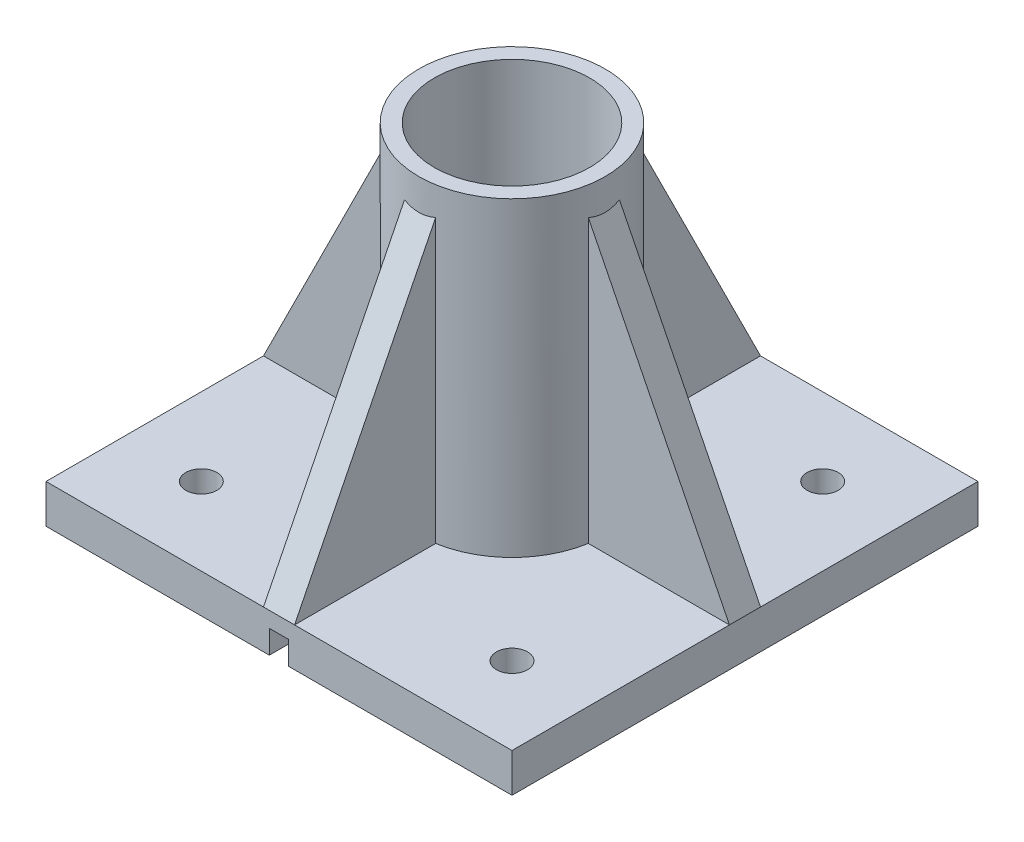
ISO-10303-21;
HEADER;
FILE_DESCRIPTION(('STEP AP214'),'2;1');
FILE_NAME('part.step','',(''),(''),'','','');
FILE_SCHEMA(('AUTOMOTIVE_DESIGN { 1 0 10303 214 1 1 1 1 }'));
ENDSEC;
DATA;
#1=APPLICATION_CONTEXT('core data for automotive mechanical design processes');
#2=APPLICATION_PROTOCOL_DEFINITION('international standard','automotive_design',2000,#1);
#3=PRODUCT_CONTEXT('',#1,'mechanical');
#4=PRODUCT('Part','Part','',(#3));
#5=PRODUCT_RELATED_PRODUCT_CATEGORY('part','',(#4));
#6=PRODUCT_DEFINITION_FORMATION('','',#4);
#7=PRODUCT_DEFINITION_CONTEXT('part definition',#1,'design');
#8=PRODUCT_DEFINITION('design','',#6,#7);
#9=PRODUCT_DEFINITION_SHAPE('','',#8);
#10=(LENGTH_UNIT() NAMED_UNIT(*) SI_UNIT(.MILLI.,.METRE.));
#11=(NAMED_UNIT(*) PLANE_ANGLE_UNIT() SI_UNIT($,.RADIAN.));
#12=(NAMED_UNIT(*) SI_UNIT($,.STERADIAN.) SOLID_ANGLE_UNIT());
#13=UNCERTAINTY_MEASURE_WITH_UNIT(LENGTH_MEASURE(1.E-05),#10,'distance_accuracy_value','');
#14=(GEOMETRIC_REPRESENTATION_CONTEXT(3) GLOBAL_UNCERTAINTY_ASSIGNED_CONTEXT((#13)) GLOBAL_UNIT_ASSIGNED_CONTEXT((#10,
#11,#12)) REPRESENTATION_CONTEXT('',''));
#15=CARTESIAN_POINT('',(0.,0.,0.));
#16=DIRECTION('',(0.,0.,1.));
#17=DIRECTION('',(1.,0.,0.));
#18=AXIS2_PLACEMENT_3D('',#15,#16,#17);
#19=CARTESIAN_POINT('',(0.,5.,0.));
#20=DIRECTION('',(0.,-1.,0.));
#21=DIRECTION('',(0.,0.,-1.));
#22=AXIS2_PLACEMENT_3D('',#19,#20,#21);
#23=PLANE('',#22);
#24=CARTESIAN_POINT('',(19.9999999999999,5.,-20.));
#25=DIRECTION('',(0.,1.,0.));
#26=DIRECTION('',(0.,0.,1.));
#27=AXIS2_PLACEMENT_3D('',#24,#25,#26);
#28=CIRCLE('',#27,2.);
#29=CARTESIAN_POINT('',(19.9999999999999,5.,-18.));
#30=VERTEX_POINT('',#29);
#31=EDGE_CURVE('E292',#30,#30,#28,.T.);
#32=ORIENTED_EDGE('',*,*,#31,.F.);
#33=EDGE_LOOP('',(#32));
#34=FACE_BOUND('',#33,.T.);
#35=DIRECTION('',(1.,0.,0.));
#36=VECTOR('',#35,1.);
#37=CARTESIAN_POINT('',(0.,5.,-2.));
#38=LINE('',#37,#36);
#39=CARTESIAN_POINT('',(30.,5.,-2.0000000000003));
#40=VERTEX_POINT('',#39);
#41=CARTESIAN_POINT('',(11.8321595661992,5.,-2.00000000000012));
#42=VERTEX_POINT('',#41);
#43=EDGE_CURVE('E58',#40,#42,#38,.F.);
#44=ORIENTED_EDGE('',*,*,#43,.F.);
#45=DIRECTION('',(0.,0.,-1.));
#46=VECTOR('',#45,1.);
#47=CARTESIAN_POINT('',(30.,5.,30.));
#48=LINE('',#47,#46);
#49=CARTESIAN_POINT('',(30.,5.,-30.));
#50=VERTEX_POINT('',#49);
#51=EDGE_CURVE('E330',#40,#50,#48,.T.);
#52=ORIENTED_EDGE('',*,*,#51,.T.);
#53=DIRECTION('',(-1.,0.,0.));
#54=VECTOR('',#53,1.);
#55=CARTESIAN_POINT('',(-30.,5.,-30.));
#56=LINE('',#55,#54);
#57=CARTESIAN_POINT('',(2.,5.,-30.));
#58=VERTEX_POINT('',#57);
#59=EDGE_CURVE('E331',#50,#58,#56,.T.);
#60=ORIENTED_EDGE('',*,*,#59,.T.);
#61=DIRECTION('',(0.,0.,-1.));
#62=VECTOR('',#61,1.);
#63=CARTESIAN_POINT('',(2.,5.,0.));
#64=LINE('',#63,#62);
#65=CARTESIAN_POINT('',(2.,5.,-11.8321595661992));
#66=VERTEX_POINT('',#65);
#67=EDGE_CURVE('E272',#58,#66,#64,.F.);
#68=ORIENTED_EDGE('',*,*,#67,.T.);
#69=CARTESIAN_POINT('',(0.,5.,0.));
#70=DIRECTION('',(0.,-1.,0.));
#71=DIRECTION('',(0.,0.,-1.));
#72=AXIS2_PLACEMENT_3D('',#69,#70,#71);
#73=CIRCLE('',#72,12.);
#74=EDGE_CURVE('E43',#42,#66,#73,.F.);
#75=ORIENTED_EDGE('',*,*,#74,.F.);
#76=EDGE_LOOP('',(#44,#52,#60,#68,#75));
#77=FACE_BOUND('',#76,.T.);
#78=ADVANCED_FACE('F34',(#34,#77),#23,.F.);
#79=CARTESIAN_POINT('',(20.,5.,20.));
#80=DIRECTION('',(0.,1.,0.));
#81=DIRECTION('',(0.,0.,1.));
#82=AXIS2_PLACEMENT_3D('',#79,#80,#81);
#83=CIRCLE('',#82,2.);
#84=CARTESIAN_POINT('',(20.,5.,22.));
#85=VERTEX_POINT('',#84);
#86=EDGE_CURVE('E303',#85,#85,#83,.T.);
#87=ORIENTED_EDGE('',*,*,#86,.F.);
#88=EDGE_LOOP('',(#87));
#89=FACE_BOUND('',#88,.T.);
#90=CARTESIAN_POINT('',(30.,5.,30.));
#91=VERTEX_POINT('',#90);
#92=CARTESIAN_POINT('',(30.,5.,2.00000000000003));
#93=VERTEX_POINT('',#92);
#94=EDGE_CURVE('E326',#91,#93,#48,.T.);
#95=ORIENTED_EDGE('',*,*,#94,.T.);
#96=DIRECTION('',(1.,0.,0.));
#97=VECTOR('',#96,1.);
#98=CARTESIAN_POINT('',(0.,5.,2.));
#99=LINE('',#98,#97);
#100=CARTESIAN_POINT('',(11.8321595661993,5.,1.99999999999988));
#101=VERTEX_POINT('',#100);
#102=EDGE_CURVE('E213',#93,#101,#99,.F.);
#103=ORIENTED_EDGE('',*,*,#102,.T.);
#104=CARTESIAN_POINT('',(2.,5.,11.8321595661992));
#105=VERTEX_POINT('',#104);
#106=EDGE_CURVE('E365',#105,#101,#73,.F.);
#107=ORIENTED_EDGE('',*,*,#106,.F.);
#108=DIRECTION('',(0.,0.,1.));
#109=VECTOR('',#108,1.);
#110=CARTESIAN_POINT('',(2.,5.,0.));
#111=LINE('',#110,#109);
#112=CARTESIAN_POINT('',(2.,5.,30.));
#113=VERTEX_POINT('',#112);
#114=EDGE_CURVE('E227',#113,#105,#111,.F.);
#115=ORIENTED_EDGE('',*,*,#114,.F.);
#116=DIRECTION('',(1.,0.,0.));
#117=VECTOR('',#116,1.);
#118=CARTESIAN_POINT('',(-30.,5.,30.));
#119=LINE('',#118,#117);
#120=EDGE_CURVE('E338',#113,#91,#119,.T.);
#121=ORIENTED_EDGE('',*,*,#120,.T.);
#122=EDGE_LOOP('',(#95,#103,#107,#115,#121));
#123=FACE_BOUND('',#122,.T.);
#124=ADVANCED_FACE('F389',(#89,#123),#23,.F.);
#125=CARTESIAN_POINT('',(-20.0000000000001,5.,-20.));
#126=DIRECTION('',(0.,1.,0.));
#127=DIRECTION('',(0.,0.,1.));
#128=AXIS2_PLACEMENT_3D('',#125,#126,#127);
#129=CIRCLE('',#128,2.);
#130=CARTESIAN_POINT('',(-20.0000000000001,5.,-18.));
#131=VERTEX_POINT('',#130);
#132=EDGE_CURVE('E296',#131,#131,#129,.T.);
#133=ORIENTED_EDGE('',*,*,#132,.F.);
#134=EDGE_LOOP('',(#133));
#135=FACE_BOUND('',#134,.T.);
#136=DIRECTION('',(0.,0.,1.));
#137=VECTOR('',#136,1.);
#138=CARTESIAN_POINT('',(-30.,5.,30.));
#139=LINE('',#138,#137);
#140=CARTESIAN_POINT('',(-30.,5.,-30.));
#141=VERTEX_POINT('',#140);
#142=CARTESIAN_POINT('',(-30.,5.,-1.99999999999998));
#143=VERTEX_POINT('',#142);
#144=EDGE_CURVE('E335',#141,#143,#139,.T.);
#145=ORIENTED_EDGE('',*,*,#144,.T.);
#146=DIRECTION('',(-1.,0.,0.));
#147=VECTOR('',#146,1.);
#148=CARTESIAN_POINT('',(0.,5.,-2.));
#149=LINE('',#148,#147);
#150=CARTESIAN_POINT('',(-11.8321595661992,5.,-1.99999999999996));
#151=VERTEX_POINT('',#150);
#152=EDGE_CURVE('E252',#143,#151,#149,.F.);
#153=ORIENTED_EDGE('',*,*,#152,.T.);
#154=CARTESIAN_POINT('',(-2.,5.,-11.8321595661992));
#155=VERTEX_POINT('',#154);
#156=EDGE_CURVE('E11',#155,#151,#73,.F.);
#157=ORIENTED_EDGE('',*,*,#156,.F.);
#158=DIRECTION('',(0.,0.,-1.));
#159=VECTOR('',#158,1.);
#160=CARTESIAN_POINT('',(-2.,5.,0.));
#161=LINE('',#160,#159);
#162=CARTESIAN_POINT('',(-2.,5.,-30.));
#163=VERTEX_POINT('',#162);
#164=EDGE_CURVE('E267',#163,#155,#161,.F.);
#165=ORIENTED_EDGE('',*,*,#164,.F.);
#166=EDGE_CURVE('E329',#163,#141,#56,.T.);
#167=ORIENTED_EDGE('',*,*,#166,.T.);
#168=EDGE_LOOP('',(#145,#153,#157,#165,#167));
#169=FACE_BOUND('',#168,.T.);
#170=ADVANCED_FACE('F424',(#135,#169),#23,.F.);
#171=CARTESIAN_POINT('',(30.,5.,30.));
#172=DIRECTION('',(-1.,0.,0.));
#173=DIRECTION('',(0.,0.,1.));
#174=AXIS2_PLACEMENT_3D('',#171,#172,#173);
#175=PLANE('',#174);
#176=DIRECTION('',(0.,0.,-1.));
#177=VECTOR('',#176,1.);
#178=CARTESIAN_POINT('',(30.,0.,30.));
#179=LINE('',#178,#177);
#180=CARTESIAN_POINT('',(30.,0.,30.));
#181=VERTEX_POINT('',#180);
#182=CARTESIAN_POINT('',(30.,0.,-30.));
#183=VERTEX_POINT('',#182);
#184=EDGE_CURVE('E325',#181,#183,#179,.T.);
#185=ORIENTED_EDGE('',*,*,#184,.T.);
#186=DIRECTION('',(0.,-1.,0.));
#187=VECTOR('',#186,1.);
#188=CARTESIAN_POINT('',(30.,5.,-30.));
#189=LINE('',#188,#187);
#190=EDGE_CURVE('E360',#50,#183,#189,.T.);
#191=ORIENTED_EDGE('',*,*,#190,.F.);
#192=ORIENTED_EDGE('',*,*,#51,.F.);
#193=DIRECTION('',(0.,0.,1.));
#194=VECTOR('',#193,1.);
#195=CARTESIAN_POINT('',(30.,5.,-3.14233320495882E-13));
#196=LINE('',#195,#194);
#197=EDGE_CURVE('E212',#40,#93,#196,.T.);
#198=ORIENTED_EDGE('',*,*,#197,.T.);
#199=ORIENTED_EDGE('',*,*,#94,.F.);
#200=DIRECTION('',(0.,-1.,0.));
#201=VECTOR('',#200,1.);
#202=CARTESIAN_POINT('',(30.,5.,30.));
#203=LINE('',#202,#201);
#204=EDGE_CURVE('E342',#91,#181,#203,.T.);
#205=ORIENTED_EDGE('',*,*,#204,.T.);
#206=EDGE_LOOP('',(#185,#191,#192,#198,#199,#205));
#207=FACE_BOUND('',#206,.T.);
#208=ADVANCED_FACE('F36',(#207),#175,.F.);
#209=CARTESIAN_POINT('',(-30.,5.,-30.));
#210=DIRECTION('',(0.,0.,1.));
#211=DIRECTION('',(1.,0.,0.));
#212=AXIS2_PLACEMENT_3D('',#209,#210,#211);
#213=PLANE('',#212);
#214=DIRECTION('',(-1.,0.,0.));
#215=VECTOR('',#214,1.);
#216=CARTESIAN_POINT('',(-30.,0.,-30.));
#217=LINE('',#216,#215);
#218=CARTESIAN_POINT('',(-30.,0.,-30.));
#219=VERTEX_POINT('',#218);
#220=EDGE_CURVE('E345',#183,#219,#217,.T.);
#221=ORIENTED_EDGE('',*,*,#220,.T.);
#222=DIRECTION('',(0.,-1.,0.));
#223=VECTOR('',#222,1.);
#224=CARTESIAN_POINT('',(-30.,5.,-30.));
#225=LINE('',#224,#223);
#226=EDGE_CURVE('E358',#141,#219,#225,.T.);
#227=ORIENTED_EDGE('',*,*,#226,.F.);
#228=ORIENTED_EDGE('',*,*,#166,.F.);
#229=DIRECTION('',(1.,0.,0.));
#230=VECTOR('',#229,1.);
#231=CARTESIAN_POINT('',(0.,5.,-30.));
#232=LINE('',#231,#230);
#233=EDGE_CURVE('E271',#163,#58,#232,.T.);
#234=ORIENTED_EDGE('',*,*,#233,.T.);
#235=ORIENTED_EDGE('',*,*,#59,.F.);
#236=ORIENTED_EDGE('',*,*,#190,.T.);
#237=EDGE_LOOP('',(#221,#227,#228,#234,#235,#236));
#238=FACE_BOUND('',#237,.T.);
#239=ADVANCED_FACE('F461',(#238),#213,.F.);
#240=CARTESIAN_POINT('',(-30.,5.,30.));
#241=DIRECTION('',(1.,0.,0.));
#242=DIRECTION('',(0.,0.,-1.));
#243=AXIS2_PLACEMENT_3D('',#240,#241,#242);
#244=PLANE('',#243);
#245=DIRECTION('',(0.,0.,1.));
#246=VECTOR('',#245,1.);
#247=CARTESIAN_POINT('',(-30.,0.,30.));
#248=LINE('',#247,#246);
#249=CARTESIAN_POINT('',(-30.,0.,30.));
#250=VERTEX_POINT('',#249);
#251=EDGE_CURVE('E347',#219,#250,#248,.T.);
#252=ORIENTED_EDGE('',*,*,#251,.T.);
#253=DIRECTION('',(0.,-1.,0.));
#254=VECTOR('',#253,1.);
#255=CARTESIAN_POINT('',(-30.,5.,30.));
#256=LINE('',#255,#254);
#257=CARTESIAN_POINT('',(-30.,5.,30.));
#258=VERTEX_POINT('',#257);
#259=EDGE_CURVE('E355',#258,#250,#256,.T.);
#260=ORIENTED_EDGE('',*,*,#259,.F.);
#261=CARTESIAN_POINT('',(-30.,5.,2.00000000000001));
#262=VERTEX_POINT('',#261);
#263=EDGE_CURVE('E334',#262,#258,#139,.T.);
#264=ORIENTED_EDGE('',*,*,#263,.F.);
#265=DIRECTION('',(0.,0.,-1.));
#266=VECTOR('',#265,1.);
#267=CARTESIAN_POINT('',(-30.,5.,1.04744440165294E-13));
#268=LINE('',#267,#266);
#269=EDGE_CURVE('E251',#262,#143,#268,.T.);
#270=ORIENTED_EDGE('',*,*,#269,.T.);
#271=ORIENTED_EDGE('',*,*,#144,.F.);
#272=ORIENTED_EDGE('',*,*,#226,.T.);
#273=EDGE_LOOP('',(#252,#260,#264,#270,#271,#272));
#274=FACE_BOUND('',#273,.T.);
#275=ADVANCED_FACE('F438',(#274),#244,.F.);
#276=CARTESIAN_POINT('',(-30.,5.,30.));
#277=DIRECTION('',(0.,0.,-1.));
#278=DIRECTION('',(-1.,0.,0.));
#279=AXIS2_PLACEMENT_3D('',#276,#277,#278);
#280=PLANE('',#279);
#281=DIRECTION('',(-1.,0.,0.));
#282=VECTOR('',#281,1.);
#283=CARTESIAN_POINT('',(-1.25,3.,30.));
#284=LINE('',#283,#282);
#285=CARTESIAN_POINT('',(1.25,3.,30.));
#286=VERTEX_POINT('',#285);
#287=CARTESIAN_POINT('',(-1.25,3.,30.));
#288=VERTEX_POINT('',#287);
#289=EDGE_CURVE('E198',#286,#288,#284,.T.);
#290=ORIENTED_EDGE('',*,*,#289,.F.);
#291=DIRECTION('',(0.,1.,0.));
#292=VECTOR('',#291,1.);
#293=CARTESIAN_POINT('',(1.25,0.,30.));
#294=LINE('',#293,#292);
#295=CARTESIAN_POINT('',(1.25,0.,30.));
#296=VERTEX_POINT('',#295);
#297=EDGE_CURVE('E179',#296,#286,#294,.T.);
#298=ORIENTED_EDGE('',*,*,#297,.F.);
#299=DIRECTION('',(1.,0.,0.));
#300=VECTOR('',#299,1.);
#301=CARTESIAN_POINT('',(-30.,0.,30.));
#302=LINE('',#301,#300);
#303=EDGE_CURVE('E349',#296,#181,#302,.T.);
#304=ORIENTED_EDGE('',*,*,#303,.T.);
#305=ORIENTED_EDGE('',*,*,#204,.F.);
#306=ORIENTED_EDGE('',*,*,#120,.F.);
#307=DIRECTION('',(-1.,0.,0.));
#308=VECTOR('',#307,1.);
#309=CARTESIAN_POINT('',(0.,5.,30.));
#310=LINE('',#309,#308);
#311=CARTESIAN_POINT('',(-2.,5.,30.));
#312=VERTEX_POINT('',#311);
#313=EDGE_CURVE('E231',#113,#312,#310,.T.);
#314=ORIENTED_EDGE('',*,*,#313,.T.);
#315=EDGE_CURVE('E339',#258,#312,#119,.T.);
#316=ORIENTED_EDGE('',*,*,#315,.F.);
#317=ORIENTED_EDGE('',*,*,#259,.T.);
#318=CARTESIAN_POINT('',(-1.25,0.,30.));
#319=VERTEX_POINT('',#318);
#320=EDGE_CURVE('E350',#250,#319,#302,.T.);
#321=ORIENTED_EDGE('',*,*,#320,.T.);
#322=DIRECTION('',(0.,-1.,0.));
#323=VECTOR('',#322,1.);
#324=CARTESIAN_POINT('',(-1.25,3.,30.));
#325=LINE('',#324,#323);
#326=EDGE_CURVE('E184',#288,#319,#325,.T.);
#327=ORIENTED_EDGE('',*,*,#326,.F.);
#328=EDGE_LOOP('',(#290,#298,#304,#305,#306,#314,#316,#317,#321,#327));
#329=FACE_BOUND('',#328,.T.);
#330=ADVANCED_FACE('F392',(#329),#280,.F.);
#331=ORIENTED_EDGE('',*,*,#315,.T.);
#332=DIRECTION('',(0.,0.,1.));
#333=VECTOR('',#332,1.);
#334=CARTESIAN_POINT('',(-2.,5.,0.));
#335=LINE('',#334,#333);
#336=CARTESIAN_POINT('',(-2.,5.,11.8321595661992));
#337=VERTEX_POINT('',#336);
#338=EDGE_CURVE('E232',#312,#337,#335,.F.);
#339=ORIENTED_EDGE('',*,*,#338,.T.);
#340=CARTESIAN_POINT('',(-11.8321595661992,5.,2.00000000000004));
#341=VERTEX_POINT('',#340);
#342=EDGE_CURVE('E42',#341,#337,#73,.F.);
#343=ORIENTED_EDGE('',*,*,#342,.F.);
#344=DIRECTION('',(-1.,0.,0.));
#345=VECTOR('',#344,1.);
#346=CARTESIAN_POINT('',(0.,5.,2.));
#347=LINE('',#346,#345);
#348=EDGE_CURVE('E247',#262,#341,#347,.F.);
#349=ORIENTED_EDGE('',*,*,#348,.F.);
#350=ORIENTED_EDGE('',*,*,#263,.T.);
#351=EDGE_LOOP('',(#331,#339,#343,#349,#350));
#352=FACE_BOUND('',#351,.T.);
#353=CARTESIAN_POINT('',(-20.,5.,20.));
#354=DIRECTION('',(0.,1.,0.));
#355=DIRECTION('',(0.,0.,1.));
#356=AXIS2_PLACEMENT_3D('',#353,#354,#355);
#357=CIRCLE('',#356,2.);
#358=CARTESIAN_POINT('',(-20.,5.,22.));
#359=VERTEX_POINT('',#358);
#360=EDGE_CURVE('E302',#359,#359,#357,.T.);
#361=ORIENTED_EDGE('',*,*,#360,.F.);
#362=EDGE_LOOP('',(#361));
#363=FACE_BOUND('',#362,.T.);
#364=ADVANCED_FACE('F420',(#352,#363),#23,.F.);
#365=CARTESIAN_POINT('',(0.,0.,0.));
#366=DIRECTION('',(0.,-1.,0.));
#367=DIRECTION('',(0.,0.,-1.));
#368=AXIS2_PLACEMENT_3D('',#365,#366,#367);
#369=PLANE('',#368);
#370=DIRECTION('',(0.,0.,1.));
#371=VECTOR('',#370,1.);
#372=CARTESIAN_POINT('',(1.25,0.,-30.001));
#373=LINE('',#372,#371);
#374=CARTESIAN_POINT('',(1.25,0.,2.1650635094611));
#375=VERTEX_POINT('',#374);
#376=EDGE_CURVE('E190',#375,#296,#373,.T.);
#377=ORIENTED_EDGE('',*,*,#376,.F.);
#378=CARTESIAN_POINT('',(0.,0.,0.));
#379=DIRECTION('',(0.,-1.,0.));
#380=DIRECTION('',(0.,0.,-1.));
#381=AXIS2_PLACEMENT_3D('',#378,#379,#380);
#382=CIRCLE('',#381,2.5);
#383=CARTESIAN_POINT('',(-1.25,0.,2.1650635094611));
#384=VERTEX_POINT('',#383);
#385=EDGE_CURVE('E196',#384,#375,#382,.T.);
#386=ORIENTED_EDGE('',*,*,#385,.F.);
#387=DIRECTION('',(0.,0.,1.));
#388=VECTOR('',#387,1.);
#389=CARTESIAN_POINT('',(-1.25,0.,-30.001));
#390=LINE('',#389,#388);
#391=EDGE_CURVE('E205',#384,#319,#390,.T.);
#392=ORIENTED_EDGE('',*,*,#391,.T.);
#393=ORIENTED_EDGE('',*,*,#320,.F.);
#394=ORIENTED_EDGE('',*,*,#251,.F.);
#395=ORIENTED_EDGE('',*,*,#220,.F.);
#396=ORIENTED_EDGE('',*,*,#184,.F.);
#397=ORIENTED_EDGE('',*,*,#303,.F.);
#398=EDGE_LOOP('',(#377,#386,#392,#393,#394,#395,#396,#397));
#399=FACE_BOUND('',#398,.T.);
#400=CARTESIAN_POINT('',(20.,0.,20.));
#401=DIRECTION('',(0.,1.,0.));
#402=DIRECTION('',(0.,0.,1.));
#403=AXIS2_PLACEMENT_3D('',#400,#401,#402);
#404=CIRCLE('',#403,2.);
#405=CARTESIAN_POINT('',(20.,0.,22.));
#406=VERTEX_POINT('',#405);
#407=EDGE_CURVE('E299',#406,#406,#404,.T.);
#408=ORIENTED_EDGE('',*,*,#407,.T.);
#409=EDGE_LOOP('',(#408));
#410=FACE_BOUND('',#409,.T.);
#411=CARTESIAN_POINT('',(-20.0000000000001,0.,-20.));
#412=DIRECTION('',(0.,1.,0.));
#413=DIRECTION('',(0.,0.,1.));
#414=AXIS2_PLACEMENT_3D('',#411,#412,#413);
#415=CIRCLE('',#414,2.);
#416=CARTESIAN_POINT('',(-20.0000000000001,0.,-18.));
#417=VERTEX_POINT('',#416);
#418=EDGE_CURVE('E306',#417,#417,#415,.T.);
#419=ORIENTED_EDGE('',*,*,#418,.T.);
#420=EDGE_LOOP('',(#419));
#421=FACE_BOUND('',#420,.T.);
#422=CARTESIAN_POINT('',(19.9999999999999,0.,-20.));
#423=DIRECTION('',(0.,1.,0.));
#424=DIRECTION('',(0.,0.,1.));
#425=AXIS2_PLACEMENT_3D('',#422,#423,#424);
#426=CIRCLE('',#425,2.);
#427=CARTESIAN_POINT('',(19.9999999999999,0.,-18.));
#428=VERTEX_POINT('',#427);
#429=EDGE_CURVE('E293',#428,#428,#426,.T.);
#430=ORIENTED_EDGE('',*,*,#429,.T.);
#431=EDGE_LOOP('',(#430));
#432=FACE_BOUND('',#431,.T.);
#433=CARTESIAN_POINT('',(-20.,0.,20.));
#434=DIRECTION('',(0.,1.,0.));
#435=DIRECTION('',(0.,0.,1.));
#436=AXIS2_PLACEMENT_3D('',#433,#434,#435);
#437=CIRCLE('',#436,2.);
#438=CARTESIAN_POINT('',(-20.,0.,22.));
#439=VERTEX_POINT('',#438);
#440=EDGE_CURVE('E311',#439,#439,#437,.T.);
#441=ORIENTED_EDGE('',*,*,#440,.T.);
#442=EDGE_LOOP('',(#441));
#443=FACE_BOUND('',#442,.T.);
#444=ADVANCED_FACE('F430',(#399,#410,#421,#432,#443),#369,.T.);
#445=CARTESIAN_POINT('',(0.,45.,0.));
#446=DIRECTION('',(0.,1.,0.));
#447=DIRECTION('',(0.,0.,1.));
#448=AXIS2_PLACEMENT_3D('',#445,#446,#447);
#449=PLANE('',#448);
#450=CARTESIAN_POINT('',(0.,45.,0.));
#451=DIRECTION('',(0.,1.,0.));
#452=DIRECTION('',(0.,0.,1.));
#453=AXIS2_PLACEMENT_3D('',#450,#451,#452);
#454=CIRCLE('',#453,10.);
#455=CARTESIAN_POINT('',(0.,45.,10.));
#456=VERTEX_POINT('',#455);
#457=EDGE_CURVE('E317',#456,#456,#454,.T.);
#458=ORIENTED_EDGE('',*,*,#457,.F.);
#459=EDGE_LOOP('',(#458));
#460=FACE_BOUND('',#459,.T.);
#461=CARTESIAN_POINT('',(0.,45.,0.));
#462=DIRECTION('',(0.,1.,0.));
#463=DIRECTION('',(0.,0.,1.));
#464=AXIS2_PLACEMENT_3D('',#461,#462,#463);
#465=CIRCLE('',#464,12.);
#466=CARTESIAN_POINT('',(0.,45.,12.));
#467=VERTEX_POINT('',#466);
#468=EDGE_CURVE('E320',#467,#467,#465,.T.);
#469=ORIENTED_EDGE('',*,*,#468,.T.);
#470=EDGE_LOOP('',(#469));
#471=FACE_BOUND('',#470,.T.);
#472=ADVANCED_FACE('F436',(#460,#471),#449,.T.);
#473=CARTESIAN_POINT('',(0.,45.,0.));
#474=DIRECTION('',(0.,-1.,0.));
#475=DIRECTION('',(0.,0.,-1.));
#476=AXIS2_PLACEMENT_3D('',#473,#474,#475);
#477=CYLINDRICAL_SURFACE('',#476,12.);
#478=CARTESIAN_POINT('',(0.,65.,0.));
#479=DIRECTION('',(0.894427190999916,-0.447213595499958,0.));
#480=DIRECTION('',(-0.447213595499958,-0.894427190999916,0.));
#481=AXIS2_PLACEMENT_3D('',#478,#479,#480);
#482=ELLIPSE('',#481,26.8328157299975,12.);
#483=CARTESIAN_POINT('',(-11.8321595661992,41.3356808676015,-1.99999999999996));
#484=VERTEX_POINT('',#483);
#485=CARTESIAN_POINT('',(-11.8321595661992,41.3356808676015,2.00000000000004));
#486=VERTEX_POINT('',#485);
#487=EDGE_CURVE('E265',#484,#486,#482,.F.);
#488=ORIENTED_EDGE('',*,*,#487,.T.);
#489=DIRECTION('',(0.,-1.,0.));
#490=VECTOR('',#489,1.);
#491=CARTESIAN_POINT('',(-11.8321595661992,45.,2.00000000000004));
#492=LINE('',#491,#490);
#493=EDGE_CURVE('E260',#341,#486,#492,.F.);
#494=ORIENTED_EDGE('',*,*,#493,.F.);
#495=ORIENTED_EDGE('',*,*,#342,.T.);
#496=DIRECTION('',(0.,-1.,0.));
#497=VECTOR('',#496,1.);
#498=CARTESIAN_POINT('',(-2.,45.,11.8321595661992));
#499=LINE('',#498,#497);
#500=CARTESIAN_POINT('',(-2.,41.3356808676015,11.8321595661992));
#501=VERTEX_POINT('',#500);
#502=EDGE_CURVE('E240',#337,#501,#499,.F.);
#503=ORIENTED_EDGE('',*,*,#502,.T.);
#504=CARTESIAN_POINT('',(0.,65.,0.));
#505=DIRECTION('',(0.,-0.447213595499958,-0.894427190999916));
#506=DIRECTION('',(0.,-0.894427190999916,0.447213595499958));
#507=AXIS2_PLACEMENT_3D('',#504,#505,#506);
#508=ELLIPSE('',#507,26.8328157299975,12.);
#509=CARTESIAN_POINT('',(2.,41.3356808676015,11.8321595661992));
#510=VERTEX_POINT('',#509);
#511=EDGE_CURVE('E245',#501,#510,#508,.F.);
#512=ORIENTED_EDGE('',*,*,#511,.T.);
#513=DIRECTION('',(0.,-1.,0.));
#514=VECTOR('',#513,1.);
#515=CARTESIAN_POINT('',(2.,45.,11.8321595661992));
#516=LINE('',#515,#514);
#517=EDGE_CURVE('E242',#105,#510,#516,.F.);
#518=ORIENTED_EDGE('',*,*,#517,.F.);
#519=ORIENTED_EDGE('',*,*,#106,.T.);
#520=DIRECTION('',(0.,-1.,0.));
#521=VECTOR('',#520,1.);
#522=CARTESIAN_POINT('',(11.8321595661993,45.,1.99999999999988));
#523=LINE('',#522,#521);
#524=CARTESIAN_POINT('',(11.8321595661993,41.3356808676015,1.99999999999988));
#525=VERTEX_POINT('',#524);
#526=EDGE_CURVE('E220',#101,#525,#523,.F.);
#527=ORIENTED_EDGE('',*,*,#526,.T.);
#528=CARTESIAN_POINT('',(0.,65.,0.));
#529=DIRECTION('',(-0.894427190999916,-0.447213595499958,0.));
#530=DIRECTION('',(0.447213595499958,-0.894427190999916,0.));
#531=AXIS2_PLACEMENT_3D('',#528,#529,#530);
#532=ELLIPSE('',#531,26.8328157299975,12.);
#533=CARTESIAN_POINT('',(11.8321595661992,41.3356808676015,-2.00000000000012));
#534=VERTEX_POINT('',#533);
#535=EDGE_CURVE('E225',#525,#534,#532,.F.);
#536=ORIENTED_EDGE('',*,*,#535,.T.);
#537=DIRECTION('',(0.,-1.,0.));
#538=VECTOR('',#537,1.);
#539=CARTESIAN_POINT('',(11.8321595661992,45.,-2.00000000000012));
#540=LINE('',#539,#538);
#541=EDGE_CURVE('E222',#42,#534,#540,.F.);
#542=ORIENTED_EDGE('',*,*,#541,.F.);
#543=ORIENTED_EDGE('',*,*,#74,.T.);
#544=DIRECTION('',(0.,-1.,0.));
#545=VECTOR('',#544,1.);
#546=CARTESIAN_POINT('',(2.,45.,-11.8321595661992));
#547=LINE('',#546,#545);
#548=CARTESIAN_POINT('',(2.,41.3356808676015,-11.8321595661992));
#549=VERTEX_POINT('',#548);
#550=EDGE_CURVE('E284',#66,#549,#547,.F.);
#551=ORIENTED_EDGE('',*,*,#550,.T.);
#552=CARTESIAN_POINT('',(0.,65.,0.));
#553=DIRECTION('',(0.,-0.447213595499958,0.894427190999916));
#554=DIRECTION('',(0.,-0.894427190999916,-0.447213595499958));
#555=AXIS2_PLACEMENT_3D('',#552,#553,#554);
#556=ELLIPSE('',#555,26.8328157299975,12.);
#557=CARTESIAN_POINT('',(-2.,41.3356808676015,-11.8321595661992));
#558=VERTEX_POINT('',#557);
#559=EDGE_CURVE('E286',#549,#558,#556,.F.);
#560=ORIENTED_EDGE('',*,*,#559,.T.);
#561=DIRECTION('',(0.,-1.,0.));
#562=VECTOR('',#561,1.);
#563=CARTESIAN_POINT('',(-2.,45.,-11.8321595661992));
#564=LINE('',#563,#562);
#565=EDGE_CURVE('E281',#155,#558,#564,.F.);
#566=ORIENTED_EDGE('',*,*,#565,.F.);
#567=ORIENTED_EDGE('',*,*,#156,.T.);
#568=DIRECTION('',(0.,-1.,0.));
#569=VECTOR('',#568,1.);
#570=CARTESIAN_POINT('',(-11.8321595661992,45.,-1.99999999999996));
#571=LINE('',#570,#569);
#572=EDGE_CURVE('E263',#151,#484,#571,.F.);
#573=ORIENTED_EDGE('',*,*,#572,.T.);
#574=EDGE_LOOP('',(#488,#494,#495,#503,#512,#518,#519,#527,#536,#542,#543,#551,#560,#566,#567,#573));
#575=FACE_BOUND('',#574,.T.);
#576=ORIENTED_EDGE('',*,*,#468,.F.);
#577=EDGE_LOOP('',(#576));
#578=FACE_BOUND('',#577,.T.);
#579=ADVANCED_FACE('F373',(#575,#578),#477,.T.);
#580=CARTESIAN_POINT('',(0.,45.,0.));
#581=DIRECTION('',(0.,-1.,0.));
#582=DIRECTION('',(0.,0.,-1.));
#583=AXIS2_PLACEMENT_3D('',#580,#581,#582);
#584=CYLINDRICAL_SURFACE('',#583,10.);
#585=CARTESIAN_POINT('',(0.,5.,0.));
#586=DIRECTION('',(0.,1.,0.));
#587=DIRECTION('',(0.,0.,1.));
#588=AXIS2_PLACEMENT_3D('',#585,#586,#587);
#589=CIRCLE('',#588,10.);
#590=CARTESIAN_POINT('',(0.,5.,10.));
#591=VERTEX_POINT('',#590);
#592=EDGE_CURVE('E314',#591,#591,#589,.T.);
#593=ORIENTED_EDGE('',*,*,#592,.F.);
#594=EDGE_LOOP('',(#593));
#595=FACE_BOUND('',#594,.T.);
#596=ORIENTED_EDGE('',*,*,#457,.T.);
#597=EDGE_LOOP('',(#596));
#598=FACE_BOUND('',#597,.T.);
#599=ADVANCED_FACE('F443',(#595,#598),#584,.F.);
#600=CARTESIAN_POINT('',(0.,5.,0.));
#601=DIRECTION('',(0.,-1.,0.));
#602=DIRECTION('',(0.,0.,-1.));
#603=AXIS2_PLACEMENT_3D('',#600,#601,#602);
#604=CIRCLE('',#603,2.5);
#605=CARTESIAN_POINT('',(0.,5.,-2.5));
#606=VERTEX_POINT('',#605);
#607=EDGE_CURVE('E289',#606,#606,#604,.F.);
#608=ORIENTED_EDGE('',*,*,#607,.F.);
#609=EDGE_LOOP('',(#608));
#610=FACE_BOUND('',#609,.T.);
#611=ORIENTED_EDGE('',*,*,#592,.T.);
#612=EDGE_LOOP('',(#611));
#613=FACE_BOUND('',#612,.T.);
#614=ADVANCED_FACE('F431',(#610,#613),#23,.F.);
#615=CARTESIAN_POINT('',(-20.,0.,20.));
#616=DIRECTION('',(0.,1.,0.));
#617=DIRECTION('',(0.,0.,1.));
#618=AXIS2_PLACEMENT_3D('',#615,#616,#617);
#619=CYLINDRICAL_SURFACE('',#618,2.);
#620=ORIENTED_EDGE('',*,*,#440,.F.);
#621=EDGE_LOOP('',(#620));
#622=FACE_BOUND('',#621,.T.);
#623=ORIENTED_EDGE('',*,*,#360,.T.);
#624=EDGE_LOOP('',(#623));
#625=FACE_BOUND('',#624,.T.);
#626=ADVANCED_FACE('F442',(#622,#625),#619,.F.);
#627=CARTESIAN_POINT('',(19.9999999999999,0.,-20.));
#628=DIRECTION('',(0.,1.,0.));
#629=DIRECTION('',(0.,0.,1.));
#630=AXIS2_PLACEMENT_3D('',#627,#628,#629);
#631=CYLINDRICAL_SURFACE('',#630,2.);
#632=ORIENTED_EDGE('',*,*,#429,.F.);
#633=EDGE_LOOP('',(#632));
#634=FACE_BOUND('',#633,.T.);
#635=ORIENTED_EDGE('',*,*,#31,.T.);
#636=EDGE_LOOP('',(#635));
#637=FACE_BOUND('',#636,.T.);
#638=ADVANCED_FACE('F449',(#634,#637),#631,.F.);
#639=CARTESIAN_POINT('',(-20.0000000000001,0.,-20.));
#640=DIRECTION('',(0.,1.,0.));
#641=DIRECTION('',(0.,0.,1.));
#642=AXIS2_PLACEMENT_3D('',#639,#640,#641);
#643=CYLINDRICAL_SURFACE('',#642,2.);
#644=ORIENTED_EDGE('',*,*,#418,.F.);
#645=EDGE_LOOP('',(#644));
#646=FACE_BOUND('',#645,.T.);
#647=ORIENTED_EDGE('',*,*,#132,.T.);
#648=EDGE_LOOP('',(#647));
#649=FACE_BOUND('',#648,.T.);
#650=ADVANCED_FACE('F697',(#646,#649),#643,.F.);
#651=CARTESIAN_POINT('',(20.,0.,20.));
#652=DIRECTION('',(0.,1.,0.));
#653=DIRECTION('',(0.,0.,1.));
#654=AXIS2_PLACEMENT_3D('',#651,#652,#653);
#655=CYLINDRICAL_SURFACE('',#654,2.);
#656=ORIENTED_EDGE('',*,*,#407,.F.);
#657=EDGE_LOOP('',(#656));
#658=FACE_BOUND('',#657,.T.);
#659=ORIENTED_EDGE('',*,*,#86,.T.);
#660=EDGE_LOOP('',(#659));
#661=FACE_BOUND('',#660,.T.);
#662=ADVANCED_FACE('F538',(#658,#661),#655,.F.);
#663=CARTESIAN_POINT('',(0.,45.001,0.));
#664=DIRECTION('',(0.,-1.,0.));
#665=DIRECTION('',(0.,0.,-1.));
#666=AXIS2_PLACEMENT_3D('',#663,#664,#665);
#667=CYLINDRICAL_SURFACE('',#666,2.5);
#668=ORIENTED_EDGE('',*,*,#385,.T.);
#669=DIRECTION('',(0.,-1.,0.));
#670=VECTOR('',#669,1.);
#671=CARTESIAN_POINT('',(1.25,45.001,2.1650635094611));
#672=LINE('',#671,#670);
#673=CARTESIAN_POINT('',(1.25,3.,2.1650635094611));
#674=VERTEX_POINT('',#673);
#675=EDGE_CURVE('E176',#674,#375,#672,.T.);
#676=ORIENTED_EDGE('',*,*,#675,.F.);
#677=CARTESIAN_POINT('',(0.,3.,0.));
#678=DIRECTION('',(0.,1.,0.));
#679=DIRECTION('',(-1.,0.,0.));
#680=AXIS2_PLACEMENT_3D('',#677,#678,#679);
#681=CIRCLE('',#680,2.5);
#682=CARTESIAN_POINT('',(-1.25,3.,2.1650635094611));
#683=VERTEX_POINT('',#682);
#684=EDGE_CURVE('E187',#683,#674,#681,.T.);
#685=ORIENTED_EDGE('',*,*,#684,.F.);
#686=DIRECTION('',(0.,-1.,0.));
#687=VECTOR('',#686,1.);
#688=CARTESIAN_POINT('',(-1.24999999999999,45.001,2.1650635094611));
#689=LINE('',#688,#687);
#690=EDGE_CURVE('E50',#384,#683,#689,.F.);
#691=ORIENTED_EDGE('',*,*,#690,.F.);
#692=EDGE_LOOP('',(#668,#676,#685,#691));
#693=FACE_BOUND('',#692,.T.);
#694=ORIENTED_EDGE('',*,*,#607,.T.);
#695=EDGE_LOOP('',(#694));
#696=FACE_BOUND('',#695,.T.);
#697=ADVANCED_FACE('F193',(#693,#696),#667,.F.);
#698=CARTESIAN_POINT('',(0.,45.,-10.));
#699=DIRECTION('',(0.,-0.447213595499958,0.894427190999916));
#700=DIRECTION('',(0.,-0.894427190999916,-0.447213595499958));
#701=AXIS2_PLACEMENT_3D('',#698,#699,#700);
#702=PLANE('',#701);
#703=ORIENTED_EDGE('',*,*,#559,.F.);
#704=DIRECTION('',(0.,-0.894427190999916,-0.447213595499958));
#705=VECTOR('',#704,1.);
#706=CARTESIAN_POINT('',(2.,45.,-10.));
#707=LINE('',#706,#705);
#708=EDGE_CURVE('E268',#549,#58,#707,.T.);
#709=ORIENTED_EDGE('',*,*,#708,.T.);
#710=ORIENTED_EDGE('',*,*,#233,.F.);
#711=DIRECTION('',(0.,-0.894427190999916,-0.447213595499958));
#712=VECTOR('',#711,1.);
#713=CARTESIAN_POINT('',(-2.,45.,-10.));
#714=LINE('',#713,#712);
#715=EDGE_CURVE('E275',#558,#163,#714,.T.);
#716=ORIENTED_EDGE('',*,*,#715,.F.);
#717=EDGE_LOOP('',(#703,#709,#710,#716));
#718=FACE_BOUND('',#717,.T.);
#719=ADVANCED_FACE('F485',(#718),#702,.F.);
#720=CARTESIAN_POINT('',(2.,22.5,0.));
#721=DIRECTION('',(1.,0.,0.));
#722=DIRECTION('',(0.,0.,-1.));
#723=AXIS2_PLACEMENT_3D('',#720,#721,#722);
#724=PLANE('',#723);
#725=ORIENTED_EDGE('',*,*,#550,.F.);
#726=ORIENTED_EDGE('',*,*,#67,.F.);
#727=ORIENTED_EDGE('',*,*,#708,.F.);
#728=EDGE_LOOP('',(#725,#726,#727));
#729=FACE_BOUND('',#728,.T.);
#730=ADVANCED_FACE('F553',(#729),#724,.T.);
#731=CARTESIAN_POINT('',(-2.,22.5,0.));
#732=DIRECTION('',(1.,0.,0.));
#733=DIRECTION('',(0.,0.,-1.));
#734=AXIS2_PLACEMENT_3D('',#731,#732,#733);
#735=PLANE('',#734);
#736=ORIENTED_EDGE('',*,*,#164,.T.);
#737=ORIENTED_EDGE('',*,*,#565,.T.);
#738=ORIENTED_EDGE('',*,*,#715,.T.);
#739=EDGE_LOOP('',(#736,#737,#738));
#740=FACE_BOUND('',#739,.T.);
#741=ADVANCED_FACE('F480',(#740),#735,.F.);
#742=CARTESIAN_POINT('',(-10.,45.,0.));
#743=DIRECTION('',(0.894427190999916,-0.447213595499958,0.));
#744=DIRECTION('',(-0.447213595499958,-0.894427190999916,0.));
#745=AXIS2_PLACEMENT_3D('',#742,#743,#744);
#746=PLANE('',#745);
#747=ORIENTED_EDGE('',*,*,#487,.F.);
#748=DIRECTION('',(-0.447213595499958,-0.894427190999916,0.));
#749=VECTOR('',#748,1.);
#750=CARTESIAN_POINT('',(-10.,45.,-1.99999999999996));
#751=LINE('',#750,#749);
#752=EDGE_CURVE('E248',#484,#143,#751,.T.);
#753=ORIENTED_EDGE('',*,*,#752,.T.);
#754=ORIENTED_EDGE('',*,*,#269,.F.);
#755=DIRECTION('',(-0.447213595499958,-0.894427190999916,0.));
#756=VECTOR('',#755,1.);
#757=CARTESIAN_POINT('',(-9.99999999999999,45.,2.00000000000004));
#758=LINE('',#757,#756);
#759=EDGE_CURVE('E254',#486,#262,#758,.T.);
#760=ORIENTED_EDGE('',*,*,#759,.F.);
#761=EDGE_LOOP('',(#747,#753,#754,#760));
#762=FACE_BOUND('',#761,.T.);
#763=ADVANCED_FACE('F474',(#762),#746,.F.);
#764=CARTESIAN_POINT('',(0.,22.5,-2.));
#765=DIRECTION('',(0.,0.,-1.));
#766=DIRECTION('',(-1.,0.,0.));
#767=AXIS2_PLACEMENT_3D('',#764,#765,#766);
#768=PLANE('',#767);
#769=ORIENTED_EDGE('',*,*,#572,.F.);
#770=ORIENTED_EDGE('',*,*,#152,.F.);
#771=ORIENTED_EDGE('',*,*,#752,.F.);
#772=EDGE_LOOP('',(#769,#770,#771));
#773=FACE_BOUND('',#772,.T.);
#774=ADVANCED_FACE('F478',(#773),#768,.T.);
#775=CARTESIAN_POINT('',(0.,22.5,2.));
#776=DIRECTION('',(0.,0.,-1.));
#777=DIRECTION('',(-1.,0.,0.));
#778=AXIS2_PLACEMENT_3D('',#775,#776,#777);
#779=PLANE('',#778);
#780=ORIENTED_EDGE('',*,*,#348,.T.);
#781=ORIENTED_EDGE('',*,*,#493,.T.);
#782=ORIENTED_EDGE('',*,*,#759,.T.);
#783=EDGE_LOOP('',(#780,#781,#782));
#784=FACE_BOUND('',#783,.T.);
#785=ADVANCED_FACE('F579',(#784),#779,.F.);
#786=CARTESIAN_POINT('',(0.,45.,10.));
#787=DIRECTION('',(0.,-0.447213595499958,-0.894427190999916));
#788=DIRECTION('',(0.,-0.894427190999916,0.447213595499958));
#789=AXIS2_PLACEMENT_3D('',#786,#787,#788);
#790=PLANE('',#789);
#791=ORIENTED_EDGE('',*,*,#511,.F.);
#792=DIRECTION('',(0.,-0.894427190999916,0.447213595499958));
#793=VECTOR('',#792,1.);
#794=CARTESIAN_POINT('',(-2.,45.,10.));
#795=LINE('',#794,#793);
#796=EDGE_CURVE('E228',#501,#312,#795,.T.);
#797=ORIENTED_EDGE('',*,*,#796,.T.);
#798=ORIENTED_EDGE('',*,*,#313,.F.);
#799=DIRECTION('',(0.,-0.894427190999916,0.447213595499958));
#800=VECTOR('',#799,1.);
#801=CARTESIAN_POINT('',(2.,45.,10.));
#802=LINE('',#801,#800);
#803=EDGE_CURVE('E234',#510,#113,#802,.T.);
#804=ORIENTED_EDGE('',*,*,#803,.F.);
#805=EDGE_LOOP('',(#791,#797,#798,#804));
#806=FACE_BOUND('',#805,.T.);
#807=ADVANCED_FACE('F383',(#806),#790,.F.);
#808=CARTESIAN_POINT('',(2.,22.5,0.));
#809=DIRECTION('',(-1.,0.,0.));
#810=DIRECTION('',(0.,0.,1.));
#811=AXIS2_PLACEMENT_3D('',#808,#809,#810);
#812=PLANE('',#811);
#813=ORIENTED_EDGE('',*,*,#114,.T.);
#814=ORIENTED_EDGE('',*,*,#517,.T.);
#815=ORIENTED_EDGE('',*,*,#803,.T.);
#816=EDGE_LOOP('',(#813,#814,#815));
#817=FACE_BOUND('',#816,.T.);
#818=ADVANCED_FACE('F386',(#817),#812,.F.);
#819=CARTESIAN_POINT('',(-2.,22.5,0.));
#820=DIRECTION('',(-1.,0.,0.));
#821=DIRECTION('',(0.,0.,1.));
#822=AXIS2_PLACEMENT_3D('',#819,#820,#821);
#823=PLANE('',#822);
#824=ORIENTED_EDGE('',*,*,#502,.F.);
#825=ORIENTED_EDGE('',*,*,#338,.F.);
#826=ORIENTED_EDGE('',*,*,#796,.F.);
#827=EDGE_LOOP('',(#824,#825,#826));
#828=FACE_BOUND('',#827,.T.);
#829=ADVANCED_FACE('F380',(#828),#823,.T.);
#830=CARTESIAN_POINT('',(10.,45.,-1.04744440165294E-13));
#831=DIRECTION('',(-0.894427190999916,-0.447213595499958,0.));
#832=DIRECTION('',(0.447213595499958,-0.894427190999916,0.));
#833=AXIS2_PLACEMENT_3D('',#830,#831,#832);
#834=PLANE('',#833);
#835=ORIENTED_EDGE('',*,*,#535,.F.);
#836=DIRECTION('',(0.447213595499958,-0.894427190999916,0.));
#837=VECTOR('',#836,1.);
#838=CARTESIAN_POINT('',(10.,45.,1.9999999999999));
#839=LINE('',#838,#837);
#840=EDGE_CURVE('E209',#525,#93,#839,.T.);
#841=ORIENTED_EDGE('',*,*,#840,.T.);
#842=ORIENTED_EDGE('',*,*,#197,.F.);
#843=DIRECTION('',(0.447213595499958,-0.894427190999916,0.));
#844=VECTOR('',#843,1.);
#845=CARTESIAN_POINT('',(9.99999999999998,45.,-2.0000000000001));
#846=LINE('',#845,#844);
#847=EDGE_CURVE('E215',#534,#40,#846,.T.);
#848=ORIENTED_EDGE('',*,*,#847,.F.);
#849=EDGE_LOOP('',(#835,#841,#842,#848));
#850=FACE_BOUND('',#849,.T.);
#851=ADVANCED_FACE('F403',(#850),#834,.F.);
#852=CARTESIAN_POINT('',(0.,22.5,-2.));
#853=DIRECTION('',(0.,0.,1.));
#854=DIRECTION('',(1.,0.,0.));
#855=AXIS2_PLACEMENT_3D('',#852,#853,#854);
#856=PLANE('',#855);
#857=ORIENTED_EDGE('',*,*,#43,.T.);
#858=ORIENTED_EDGE('',*,*,#541,.T.);
#859=ORIENTED_EDGE('',*,*,#847,.T.);
#860=EDGE_LOOP('',(#857,#858,#859));
#861=FACE_BOUND('',#860,.T.);
#862=ADVANCED_FACE('F408',(#861),#856,.F.);
#863=CARTESIAN_POINT('',(0.,22.5,2.));
#864=DIRECTION('',(0.,0.,1.));
#865=DIRECTION('',(1.,0.,0.));
#866=AXIS2_PLACEMENT_3D('',#863,#864,#865);
#867=PLANE('',#866);
#868=ORIENTED_EDGE('',*,*,#526,.F.);
#869=ORIENTED_EDGE('',*,*,#102,.F.);
#870=ORIENTED_EDGE('',*,*,#840,.F.);
#871=EDGE_LOOP('',(#868,#869,#870));
#872=FACE_BOUND('',#871,.T.);
#873=ADVANCED_FACE('F406',(#872),#867,.T.);
#874=CARTESIAN_POINT('',(1.25,0.,-30.001));
#875=DIRECTION('',(1.,0.,0.));
#876=DIRECTION('',(0.,0.,-1.));
#877=AXIS2_PLACEMENT_3D('',#874,#875,#876);
#878=PLANE('',#877);
#879=ORIENTED_EDGE('',*,*,#675,.T.);
#880=ORIENTED_EDGE('',*,*,#376,.T.);
#881=ORIENTED_EDGE('',*,*,#297,.T.);
#882=DIRECTION('',(0.,0.,1.));
#883=VECTOR('',#882,1.);
#884=CARTESIAN_POINT('',(1.25,3.,-30.001));
#885=LINE('',#884,#883);
#886=EDGE_CURVE('E172',#674,#286,#885,.T.);
#887=ORIENTED_EDGE('',*,*,#886,.F.);
#888=EDGE_LOOP('',(#879,#880,#881,#887));
#889=FACE_BOUND('',#888,.T.);
#890=ADVANCED_FACE('F174',(#889),#878,.F.);
#891=CARTESIAN_POINT('',(-1.25,3.,-30.001));
#892=DIRECTION('',(-1.,0.,0.));
#893=DIRECTION('',(0.,-1.,0.));
#894=AXIS2_PLACEMENT_3D('',#891,#892,#893);
#895=PLANE('',#894);
#896=ORIENTED_EDGE('',*,*,#690,.T.);
#897=DIRECTION('',(0.,0.,1.));
#898=VECTOR('',#897,1.);
#899=CARTESIAN_POINT('',(-1.25,3.,-30.001));
#900=LINE('',#899,#898);
#901=EDGE_CURVE('E183',#683,#288,#900,.T.);
#902=ORIENTED_EDGE('',*,*,#901,.T.);
#903=ORIENTED_EDGE('',*,*,#326,.T.);
#904=ORIENTED_EDGE('',*,*,#391,.F.);
#905=EDGE_LOOP('',(#896,#902,#903,#904));
#906=FACE_BOUND('',#905,.T.);
#907=ADVANCED_FACE('F495',(#906),#895,.F.);
#908=CARTESIAN_POINT('',(-1.25,3.,-30.001));
#909=DIRECTION('',(0.,1.,0.));
#910=DIRECTION('',(-1.,0.,0.));
#911=AXIS2_PLACEMENT_3D('',#908,#909,#910);
#912=PLANE('',#911);
#913=ORIENTED_EDGE('',*,*,#684,.T.);
#914=ORIENTED_EDGE('',*,*,#886,.T.);
#915=ORIENTED_EDGE('',*,*,#289,.T.);
#916=ORIENTED_EDGE('',*,*,#901,.F.);
#917=EDGE_LOOP('',(#913,#914,#915,#916));
#918=FACE_BOUND('',#917,.T.);
#919=ADVANCED_FACE('F188',(#918),#912,.F.);
#920=CLOSED_SHELL('',(#78,#124,#170,#208,#239,#275,#330,#364,#444,#472,#579,#599,#614,#626,#638,
#650,#662,#697,#719,#730,#741,#763,#774,#785,#807,#818,#829,#851,#862,#873,#890,#907,#919));
#921=MANIFOLD_SOLID_BREP('B2',#920);
#922=ADVANCED_BREP_SHAPE_REPRESENTATION('',(#18,#921),#14);
#923=SHAPE_DEFINITION_REPRESENTATION(#9,#922);
ENDSEC;
END-ISO-10303-21;
